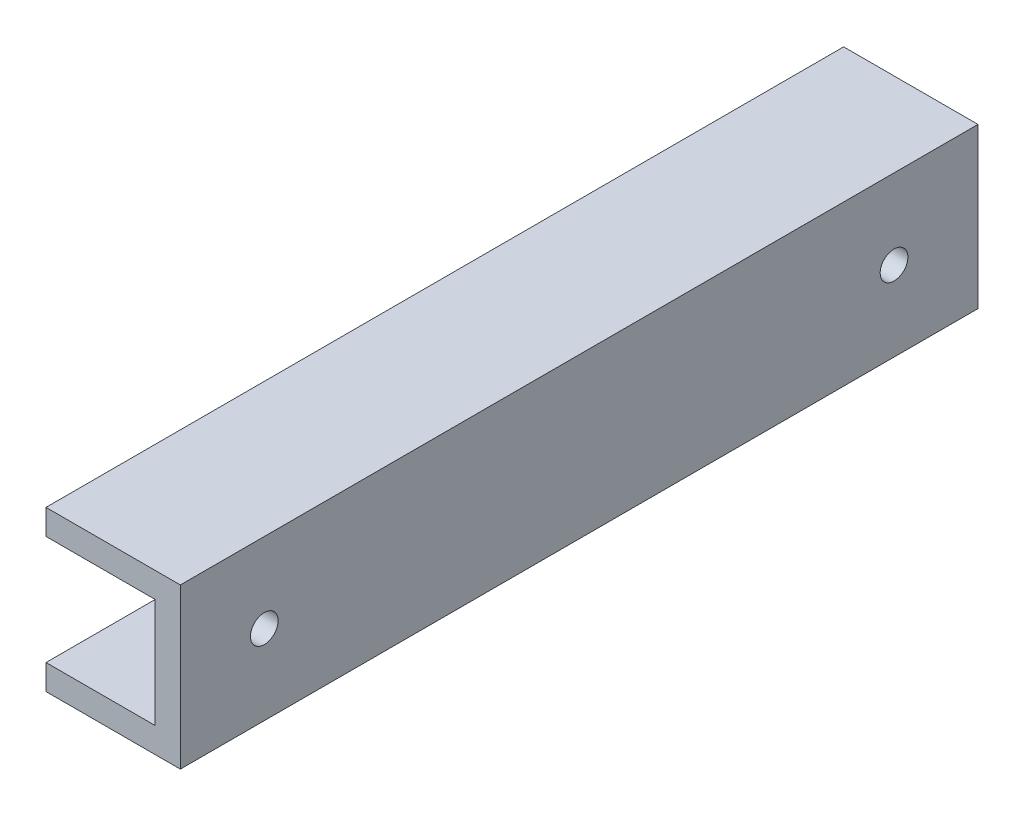
ISO-10303-21;
HEADER;
FILE_DESCRIPTION(('STEP AP214'),'2;1');
FILE_NAME('part.step','',(''),(''),'','','');
FILE_SCHEMA(('AUTOMOTIVE_DESIGN { 1 0 10303 214 1 1 1 1 }'));
ENDSEC;
DATA;
#1=APPLICATION_CONTEXT('core data for automotive mechanical design processes');
#2=APPLICATION_PROTOCOL_DEFINITION('international standard','automotive_design',2000,#1);
#3=PRODUCT_CONTEXT('',#1,'mechanical');
#4=PRODUCT('Part','Part','',(#3));
#5=PRODUCT_RELATED_PRODUCT_CATEGORY('part','',(#4));
#6=PRODUCT_DEFINITION_FORMATION('','',#4);
#7=PRODUCT_DEFINITION_CONTEXT('part definition',#1,'design');
#8=PRODUCT_DEFINITION('design','',#6,#7);
#9=PRODUCT_DEFINITION_SHAPE('','',#8);
#10=(LENGTH_UNIT() NAMED_UNIT(*) SI_UNIT(.MILLI.,.METRE.));
#11=(NAMED_UNIT(*) PLANE_ANGLE_UNIT() SI_UNIT($,.RADIAN.));
#12=(NAMED_UNIT(*) SI_UNIT($,.STERADIAN.) SOLID_ANGLE_UNIT());
#13=UNCERTAINTY_MEASURE_WITH_UNIT(LENGTH_MEASURE(1.E-05),#10,'distance_accuracy_value','');
#14=(GEOMETRIC_REPRESENTATION_CONTEXT(3) GLOBAL_UNCERTAINTY_ASSIGNED_CONTEXT((#13)) GLOBAL_UNIT_ASSIGNED_CONTEXT((#10,
#11,#12)) REPRESENTATION_CONTEXT('',''));
#15=CARTESIAN_POINT('',(0.,0.,0.));
#16=DIRECTION('',(0.,0.,1.));
#17=DIRECTION('',(1.,0.,0.));
#18=AXIS2_PLACEMENT_3D('',#15,#16,#17);
#19=CARTESIAN_POINT('',(3.,13.,23.));
#20=DIRECTION('',(0.,0.,1.));
#21=DIRECTION('',(0.,-1.,0.));
#22=AXIS2_PLACEMENT_3D('',#19,#20,#21);
#23=PLANE('',#22);
#24=DIRECTION('',(1.,0.,0.));
#25=VECTOR('',#24,1.);
#26=CARTESIAN_POINT('',(3.,13.,23.));
#27=LINE('',#26,#25);
#28=CARTESIAN_POINT('',(3.,13.,23.));
#29=VERTEX_POINT('',#28);
#30=CARTESIAN_POINT('',(8.99999999999997,13.,23.));
#31=VERTEX_POINT('',#30);
#32=EDGE_CURVE('E237',#29,#31,#27,.T.);
#33=ORIENTED_EDGE('',*,*,#32,.T.);
#34=DIRECTION('',(0.,-1.,0.));
#35=VECTOR('',#34,1.);
#36=CARTESIAN_POINT('',(8.99999999999997,13.,23.));
#37=LINE('',#36,#35);
#38=CARTESIAN_POINT('',(9.00000000000001,9.,23.));
#39=VERTEX_POINT('',#38);
#40=EDGE_CURVE('E71',#31,#39,#37,.T.);
#41=ORIENTED_EDGE('',*,*,#40,.T.);
#42=DIRECTION('',(-1.,0.,0.));
#43=VECTOR('',#42,1.);
#44=CARTESIAN_POINT('',(6.,9.,23.));
#45=LINE('',#44,#43);
#46=CARTESIAN_POINT('',(3.,9.,23.));
#47=VERTEX_POINT('',#46);
#48=EDGE_CURVE('E352',#39,#47,#45,.T.);
#49=ORIENTED_EDGE('',*,*,#48,.T.);
#50=DIRECTION('',(0.,-1.,0.));
#51=VECTOR('',#50,1.);
#52=CARTESIAN_POINT('',(3.,13.,23.));
#53=LINE('',#52,#51);
#54=EDGE_CURVE('E223',#29,#47,#53,.T.);
#55=ORIENTED_EDGE('',*,*,#54,.F.);
#56=EDGE_LOOP('',(#33,#41,#49,#55));
#57=FACE_BOUND('',#56,.T.);
#58=ADVANCED_FACE('F62',(#57),#23,.F.);
#59=CARTESIAN_POINT('',(3.,13.,72.));
#60=DIRECTION('',(0.,0.,-1.));
#61=DIRECTION('',(-1.,0.,0.));
#62=AXIS2_PLACEMENT_3D('',#59,#60,#61);
#63=PLANE('',#62);
#64=DIRECTION('',(1.,0.,0.));
#65=VECTOR('',#64,1.);
#66=CARTESIAN_POINT('',(3.,0.,72.));
#67=LINE('',#66,#65);
#68=CARTESIAN_POINT('',(3.,0.,72.));
#69=VERTEX_POINT('',#68);
#70=CARTESIAN_POINT('',(8.99999999999997,0.,72.));
#71=VERTEX_POINT('',#70);
#72=EDGE_CURVE('E224',#69,#71,#67,.T.);
#73=ORIENTED_EDGE('',*,*,#72,.T.);
#74=DIRECTION('',(0.,1.,0.));
#75=VECTOR('',#74,1.);
#76=CARTESIAN_POINT('',(8.99999999999997,13.,72.));
#77=LINE('',#76,#75);
#78=CARTESIAN_POINT('',(9.00000000000003,4.,72.));
#79=VERTEX_POINT('',#78);
#80=EDGE_CURVE('E334',#71,#79,#77,.T.);
#81=ORIENTED_EDGE('',*,*,#80,.T.);
#82=DIRECTION('',(-1.,0.,0.));
#83=VECTOR('',#82,1.);
#84=CARTESIAN_POINT('',(6.,4.,72.));
#85=LINE('',#84,#83);
#86=CARTESIAN_POINT('',(3.,4.,72.));
#87=VERTEX_POINT('',#86);
#88=EDGE_CURVE('E209',#79,#87,#85,.T.);
#89=ORIENTED_EDGE('',*,*,#88,.T.);
#90=DIRECTION('',(0.,1.,0.));
#91=VECTOR('',#90,1.);
#92=CARTESIAN_POINT('',(3.,13.,72.));
#93=LINE('',#92,#91);
#94=EDGE_CURVE('E218',#69,#87,#93,.T.);
#95=ORIENTED_EDGE('',*,*,#94,.F.);
#96=EDGE_LOOP('',(#73,#81,#89,#95));
#97=FACE_BOUND('',#96,.T.);
#98=ADVANCED_FACE('F424',(#97),#63,.F.);
#99=CARTESIAN_POINT('',(3.,0.,0.));
#100=DIRECTION('',(-1.,0.,0.));
#101=DIRECTION('',(0.,0.,1.));
#102=AXIS2_PLACEMENT_3D('',#99,#100,#101);
#103=PLANE('',#102);
#104=DIRECTION('',(0.,0.,-1.));
#105=VECTOR('',#104,1.);
#106=CARTESIAN_POINT('',(3.,9.,23.));
#107=LINE('',#106,#105);
#108=CARTESIAN_POINT('',(3.,9.,72.));
#109=VERTEX_POINT('',#108);
#110=EDGE_CURVE('E219',#109,#47,#107,.T.);
#111=ORIENTED_EDGE('',*,*,#110,.F.);
#112=CARTESIAN_POINT('',(3.,13.,72.));
#113=VERTEX_POINT('',#112);
#114=EDGE_CURVE('E361',#109,#113,#93,.T.);
#115=ORIENTED_EDGE('',*,*,#114,.T.);
#116=DIRECTION('',(0.,0.,-1.));
#117=VECTOR('',#116,1.);
#118=CARTESIAN_POINT('',(3.,13.,23.));
#119=LINE('',#118,#117);
#120=EDGE_CURVE('E234',#113,#29,#119,.T.);
#121=ORIENTED_EDGE('',*,*,#120,.T.);
#122=ORIENTED_EDGE('',*,*,#54,.T.);
#123=EDGE_LOOP('',(#111,#115,#121,#122));
#124=FACE_BOUND('',#123,.T.);
#125=ADVANCED_FACE('F429',(#124),#103,.T.);
#126=CARTESIAN_POINT('',(0.,0.,95.));
#127=DIRECTION('',(0.,1.,0.));
#128=DIRECTION('',(0.,0.,1.));
#129=AXIS2_PLACEMENT_3D('',#126,#127,#128);
#130=PLANE('',#129);
#131=DIRECTION('',(0.,0.,-1.));
#132=VECTOR('',#131,1.);
#133=CARTESIAN_POINT('',(13.,0.,95.));
#134=LINE('',#133,#132);
#135=CARTESIAN_POINT('',(13.,0.,95.));
#136=VERTEX_POINT('',#135);
#137=CARTESIAN_POINT('',(13.,0.,76.));
#138=VERTEX_POINT('',#137);
#139=EDGE_CURVE('E285',#136,#138,#134,.T.);
#140=ORIENTED_EDGE('',*,*,#139,.T.);
#141=DIRECTION('',(-0.707106781186551,0.,-0.707106781186544));
#142=VECTOR('',#141,1.);
#143=CARTESIAN_POINT('',(15.9999999999999,0.,78.9999999999999));
#144=LINE('',#143,#142);
#145=EDGE_CURVE('E344',#138,#71,#144,.T.);
#146=ORIENTED_EDGE('',*,*,#145,.T.);
#147=ORIENTED_EDGE('',*,*,#72,.F.);
#148=DIRECTION('',(0.,0.,1.));
#149=VECTOR('',#148,1.);
#150=CARTESIAN_POINT('',(3.,0.,23.));
#151=LINE('',#150,#149);
#152=CARTESIAN_POINT('',(3.,0.,23.));
#153=VERTEX_POINT('',#152);
#154=EDGE_CURVE('E227',#153,#69,#151,.T.);
#155=ORIENTED_EDGE('',*,*,#154,.F.);
#156=DIRECTION('',(1.,0.,0.));
#157=VECTOR('',#156,1.);
#158=CARTESIAN_POINT('',(3.,0.,23.));
#159=LINE('',#158,#157);
#160=CARTESIAN_POINT('',(8.99999999999997,0.,23.));
#161=VERTEX_POINT('',#160);
#162=EDGE_CURVE('E222',#153,#161,#159,.T.);
#163=ORIENTED_EDGE('',*,*,#162,.T.);
#164=DIRECTION('',(0.707106781186552,0.,-0.707106781186543));
#165=VECTOR('',#164,1.);
#166=CARTESIAN_POINT('',(-31.5000000000001,0.,63.4999999999996));
#167=LINE('',#166,#165);
#168=CARTESIAN_POINT('',(13.,0.,19.));
#169=VERTEX_POINT('',#168);
#170=EDGE_CURVE('E78',#161,#169,#167,.T.);
#171=ORIENTED_EDGE('',*,*,#170,.T.);
#172=CARTESIAN_POINT('',(13.,0.,0.));
#173=VERTEX_POINT('',#172);
#174=EDGE_CURVE('E284',#169,#173,#134,.T.);
#175=ORIENTED_EDGE('',*,*,#174,.T.);
#176=DIRECTION('',(1.,0.,0.));
#177=VECTOR('',#176,1.);
#178=CARTESIAN_POINT('',(0.,0.,0.));
#179=LINE('',#178,#177);
#180=CARTESIAN_POINT('',(0.,0.,0.));
#181=VERTEX_POINT('',#180);
#182=EDGE_CURVE('E260',#181,#173,#179,.T.);
#183=ORIENTED_EDGE('',*,*,#182,.F.);
#184=DIRECTION('',(0.,0.,-1.));
#185=VECTOR('',#184,1.);
#186=CARTESIAN_POINT('',(0.,0.,95.));
#187=LINE('',#186,#185);
#188=CARTESIAN_POINT('',(0.,0.,95.));
#189=VERTEX_POINT('',#188);
#190=EDGE_CURVE('E288',#189,#181,#187,.T.);
#191=ORIENTED_EDGE('',*,*,#190,.F.);
#192=DIRECTION('',(1.,0.,0.));
#193=VECTOR('',#192,1.);
#194=CARTESIAN_POINT('',(0.,0.,95.));
#195=LINE('',#194,#193);
#196=EDGE_CURVE('E261',#189,#136,#195,.T.);
#197=ORIENTED_EDGE('',*,*,#196,.T.);
#198=EDGE_LOOP('',(#140,#146,#147,#155,#163,#171,#175,#183,#191,#197));
#199=FACE_BOUND('',#198,.T.);
#200=ADVANCED_FACE('F397',(#199),#130,.T.);
#201=CARTESIAN_POINT('',(13.,0.,95.));
#202=DIRECTION('',(-1.,0.,0.));
#203=DIRECTION('',(0.,0.,1.));
#204=AXIS2_PLACEMENT_3D('',#201,#202,#203);
#205=PLANE('',#204);
#206=CARTESIAN_POINT('',(13.,6.5,85.));
#207=DIRECTION('',(-1.,0.,0.));
#208=DIRECTION('',(0.,0.,1.));
#209=AXIS2_PLACEMENT_3D('',#206,#207,#208);
#210=CIRCLE('',#209,1.65);
#211=CARTESIAN_POINT('',(13.,6.5,86.65));
#212=VERTEX_POINT('',#211);
#213=EDGE_CURVE('E248',#212,#212,#210,.T.);
#214=ORIENTED_EDGE('',*,*,#213,.F.);
#215=EDGE_LOOP('',(#214));
#216=FACE_BOUND('',#215,.T.);
#217=DIRECTION('',(0.,0.,-1.));
#218=VECTOR('',#217,1.);
#219=CARTESIAN_POINT('',(13.,13.,95.));
#220=LINE('',#219,#218);
#221=CARTESIAN_POINT('',(13.,13.,95.));
#222=VERTEX_POINT('',#221);
#223=CARTESIAN_POINT('',(13.,13.,76.));
#224=VERTEX_POINT('',#223);
#225=EDGE_CURVE('E281',#222,#224,#220,.T.);
#226=ORIENTED_EDGE('',*,*,#225,.T.);
#227=DIRECTION('',(0.,-1.,0.));
#228=VECTOR('',#227,1.);
#229=CARTESIAN_POINT('',(13.,0.,76.));
#230=LINE('',#229,#228);
#231=EDGE_CURVE('E341',#224,#138,#230,.T.);
#232=ORIENTED_EDGE('',*,*,#231,.T.);
#233=ORIENTED_EDGE('',*,*,#139,.F.);
#234=DIRECTION('',(0.,1.,0.));
#235=VECTOR('',#234,1.);
#236=CARTESIAN_POINT('',(13.,0.,95.));
#237=LINE('',#236,#235);
#238=EDGE_CURVE('E263',#136,#222,#237,.T.);
#239=ORIENTED_EDGE('',*,*,#238,.T.);
#240=EDGE_LOOP('',(#226,#232,#233,#239));
#241=FACE_BOUND('',#240,.T.);
#242=ADVANCED_FACE('F395',(#216,#241),#205,.T.);
#243=CARTESIAN_POINT('',(0.,13.,95.));
#244=DIRECTION('',(0.,-1.,0.));
#245=DIRECTION('',(0.,0.,-1.));
#246=AXIS2_PLACEMENT_3D('',#243,#244,#245);
#247=PLANE('',#246);
#248=DIRECTION('',(1.,0.,0.));
#249=VECTOR('',#248,1.);
#250=CARTESIAN_POINT('',(3.,13.,72.));
#251=LINE('',#250,#249);
#252=CARTESIAN_POINT('',(8.99999999999997,13.,72.));
#253=VERTEX_POINT('',#252);
#254=EDGE_CURVE('E229',#113,#253,#251,.T.);
#255=ORIENTED_EDGE('',*,*,#254,.T.);
#256=DIRECTION('',(0.707106781186551,0.,0.707106781186544));
#257=VECTOR('',#256,1.);
#258=CARTESIAN_POINT('',(15.9999999999999,13.,78.9999999999999));
#259=LINE('',#258,#257);
#260=EDGE_CURVE('E339',#253,#224,#259,.T.);
#261=ORIENTED_EDGE('',*,*,#260,.T.);
#262=ORIENTED_EDGE('',*,*,#225,.F.);
#263=DIRECTION('',(-1.,0.,0.));
#264=VECTOR('',#263,1.);
#265=CARTESIAN_POINT('',(0.,13.,95.));
#266=LINE('',#265,#264);
#267=CARTESIAN_POINT('',(0.,13.,95.));
#268=VERTEX_POINT('',#267);
#269=EDGE_CURVE('E267',#222,#268,#266,.T.);
#270=ORIENTED_EDGE('',*,*,#269,.T.);
#271=DIRECTION('',(0.,0.,-1.));
#272=VECTOR('',#271,1.);
#273=CARTESIAN_POINT('',(0.,13.,95.));
#274=LINE('',#273,#272);
#275=CARTESIAN_POINT('',(0.,13.,0.));
#276=VERTEX_POINT('',#275);
#277=EDGE_CURVE('E270',#268,#276,#274,.T.);
#278=ORIENTED_EDGE('',*,*,#277,.T.);
#279=DIRECTION('',(-1.,0.,0.));
#280=VECTOR('',#279,1.);
#281=CARTESIAN_POINT('',(0.,13.,0.));
#282=LINE('',#281,#280);
#283=CARTESIAN_POINT('',(13.,13.,0.));
#284=VERTEX_POINT('',#283);
#285=EDGE_CURVE('E264',#284,#276,#282,.T.);
#286=ORIENTED_EDGE('',*,*,#285,.F.);
#287=CARTESIAN_POINT('',(13.,13.,19.));
#288=VERTEX_POINT('',#287);
#289=EDGE_CURVE('E280',#288,#284,#220,.T.);
#290=ORIENTED_EDGE('',*,*,#289,.F.);
#291=DIRECTION('',(-0.707106781186552,0.,0.707106781186543));
#292=VECTOR('',#291,1.);
#293=CARTESIAN_POINT('',(-31.5000000000001,13.,63.4999999999996));
#294=LINE('',#293,#292);
#295=EDGE_CURVE('E337',#288,#31,#294,.T.);
#296=ORIENTED_EDGE('',*,*,#295,.T.);
#297=ORIENTED_EDGE('',*,*,#32,.F.);
#298=ORIENTED_EDGE('',*,*,#120,.F.);
#299=EDGE_LOOP('',(#255,#261,#262,#270,#278,#286,#290,#296,#297,#298));
#300=FACE_BOUND('',#299,.T.);
#301=ADVANCED_FACE('F384',(#300),#247,.T.);
#302=CARTESIAN_POINT('',(13.,6.5,10.));
#303=DIRECTION('',(-1.,0.,0.));
#304=DIRECTION('',(0.,0.,1.));
#305=AXIS2_PLACEMENT_3D('',#302,#303,#304);
#306=CIRCLE('',#305,1.65);
#307=CARTESIAN_POINT('',(13.,6.5,11.65));
#308=VERTEX_POINT('',#307);
#309=EDGE_CURVE('E256',#308,#308,#306,.T.);
#310=ORIENTED_EDGE('',*,*,#309,.F.);
#311=EDGE_LOOP('',(#310));
#312=FACE_BOUND('',#311,.T.);
#313=ORIENTED_EDGE('',*,*,#174,.F.);
#314=DIRECTION('',(0.,1.,0.));
#315=VECTOR('',#314,1.);
#316=CARTESIAN_POINT('',(13.,0.,19.));
#317=LINE('',#316,#315);
#318=EDGE_CURVE('E12',#169,#288,#317,.T.);
#319=ORIENTED_EDGE('',*,*,#318,.T.);
#320=ORIENTED_EDGE('',*,*,#289,.T.);
#321=DIRECTION('',(0.,1.,0.));
#322=VECTOR('',#321,1.);
#323=CARTESIAN_POINT('',(13.,0.,0.));
#324=LINE('',#323,#322);
#325=EDGE_CURVE('E273',#173,#284,#324,.T.);
#326=ORIENTED_EDGE('',*,*,#325,.F.);
#327=EDGE_LOOP('',(#313,#319,#320,#326));
#328=FACE_BOUND('',#327,.T.);
#329=ADVANCED_FACE('F417',(#312,#328),#205,.T.);
#330=CARTESIAN_POINT('',(0.,0.,95.));
#331=DIRECTION('',(0.,0.,1.));
#332=DIRECTION('',(1.,0.,0.));
#333=AXIS2_PLACEMENT_3D('',#330,#331,#332);
#334=PLANE('',#333);
#335=DIRECTION('',(-1.,0.,0.));
#336=VECTOR('',#335,1.);
#337=CARTESIAN_POINT('',(0.,16.,95.));
#338=LINE('',#337,#336);
#339=CARTESIAN_POINT('',(16.,16.,95.));
#340=VERTEX_POINT('',#339);
#341=CARTESIAN_POINT('',(0.,16.,95.));
#342=VERTEX_POINT('',#341);
#343=EDGE_CURVE('E296',#340,#342,#338,.T.);
#344=ORIENTED_EDGE('',*,*,#343,.T.);
#345=DIRECTION('',(0.,-1.,0.));
#346=VECTOR('',#345,1.);
#347=CARTESIAN_POINT('',(0.,0.,95.));
#348=LINE('',#347,#346);
#349=EDGE_CURVE('E244',#342,#268,#348,.T.);
#350=ORIENTED_EDGE('',*,*,#349,.T.);
#351=ORIENTED_EDGE('',*,*,#269,.F.);
#352=ORIENTED_EDGE('',*,*,#238,.F.);
#353=ORIENTED_EDGE('',*,*,#196,.F.);
#354=CARTESIAN_POINT('',(0.,-3.,95.));
#355=VERTEX_POINT('',#354);
#356=EDGE_CURVE('E249',#189,#355,#348,.T.);
#357=ORIENTED_EDGE('',*,*,#356,.T.);
#358=DIRECTION('',(1.,0.,0.));
#359=VECTOR('',#358,1.);
#360=CARTESIAN_POINT('',(0.,-3.,95.));
#361=LINE('',#360,#359);
#362=CARTESIAN_POINT('',(16.,-3.,95.));
#363=VERTEX_POINT('',#362);
#364=EDGE_CURVE('E291',#355,#363,#361,.T.);
#365=ORIENTED_EDGE('',*,*,#364,.T.);
#366=DIRECTION('',(0.,1.,0.));
#367=VECTOR('',#366,1.);
#368=CARTESIAN_POINT('',(16.,0.,95.));
#369=LINE('',#368,#367);
#370=EDGE_CURVE('E293',#363,#340,#369,.T.);
#371=ORIENTED_EDGE('',*,*,#370,.T.);
#372=EDGE_LOOP('',(#344,#350,#351,#352,#353,#357,#365,#371));
#373=FACE_BOUND('',#372,.T.);
#374=ADVANCED_FACE('F404',(#373),#334,.T.);
#375=CARTESIAN_POINT('',(0.,0.,0.));
#376=DIRECTION('',(0.,0.,1.));
#377=DIRECTION('',(1.,0.,0.));
#378=AXIS2_PLACEMENT_3D('',#375,#376,#377);
#379=PLANE('',#378);
#380=DIRECTION('',(0.,-1.,0.));
#381=VECTOR('',#380,1.);
#382=CARTESIAN_POINT('',(0.,0.,0.));
#383=LINE('',#382,#381);
#384=CARTESIAN_POINT('',(0.,16.,0.));
#385=VERTEX_POINT('',#384);
#386=EDGE_CURVE('E242',#385,#276,#383,.T.);
#387=ORIENTED_EDGE('',*,*,#386,.F.);
#388=DIRECTION('',(-1.,0.,0.));
#389=VECTOR('',#388,1.);
#390=CARTESIAN_POINT('',(0.,16.,0.));
#391=LINE('',#390,#389);
#392=CARTESIAN_POINT('',(16.,16.,0.));
#393=VERTEX_POINT('',#392);
#394=EDGE_CURVE('E294',#393,#385,#391,.T.);
#395=ORIENTED_EDGE('',*,*,#394,.F.);
#396=DIRECTION('',(0.,1.,0.));
#397=VECTOR('',#396,1.);
#398=CARTESIAN_POINT('',(16.,0.,0.));
#399=LINE('',#398,#397);
#400=CARTESIAN_POINT('',(16.,-3.,0.));
#401=VERTEX_POINT('',#400);
#402=EDGE_CURVE('E301',#401,#393,#399,.T.);
#403=ORIENTED_EDGE('',*,*,#402,.F.);
#404=DIRECTION('',(1.,0.,0.));
#405=VECTOR('',#404,1.);
#406=CARTESIAN_POINT('',(0.,-3.,0.));
#407=LINE('',#406,#405);
#408=CARTESIAN_POINT('',(0.,-3.,0.));
#409=VERTEX_POINT('',#408);
#410=EDGE_CURVE('E290',#409,#401,#407,.T.);
#411=ORIENTED_EDGE('',*,*,#410,.F.);
#412=EDGE_CURVE('E241',#181,#409,#383,.T.);
#413=ORIENTED_EDGE('',*,*,#412,.F.);
#414=ORIENTED_EDGE('',*,*,#182,.T.);
#415=ORIENTED_EDGE('',*,*,#325,.T.);
#416=ORIENTED_EDGE('',*,*,#285,.T.);
#417=EDGE_LOOP('',(#387,#395,#403,#411,#413,#414,#415,#416));
#418=FACE_BOUND('',#417,.T.);
#419=ADVANCED_FACE('F412',(#418),#379,.F.);
#420=CARTESIAN_POINT('',(0.,-3.,95.));
#421=DIRECTION('',(0.,1.,0.));
#422=DIRECTION('',(0.,0.,1.));
#423=AXIS2_PLACEMENT_3D('',#420,#421,#422);
#424=PLANE('',#423);
#425=DIRECTION('',(0.,0.,1.));
#426=VECTOR('',#425,1.);
#427=CARTESIAN_POINT('',(0.,-3.,95.));
#428=LINE('',#427,#426);
#429=EDGE_CURVE('E250',#409,#355,#428,.T.);
#430=ORIENTED_EDGE('',*,*,#429,.F.);
#431=ORIENTED_EDGE('',*,*,#410,.T.);
#432=DIRECTION('',(0.,0.,-1.));
#433=VECTOR('',#432,1.);
#434=CARTESIAN_POINT('',(16.,-3.,95.));
#435=LINE('',#434,#433);
#436=EDGE_CURVE('E307',#363,#401,#435,.T.);
#437=ORIENTED_EDGE('',*,*,#436,.F.);
#438=ORIENTED_EDGE('',*,*,#364,.F.);
#439=EDGE_LOOP('',(#430,#431,#437,#438));
#440=FACE_BOUND('',#439,.T.);
#441=ADVANCED_FACE('F467',(#440),#424,.F.);
#442=CARTESIAN_POINT('',(0.,16.,95.));
#443=DIRECTION('',(0.,-1.,0.));
#444=DIRECTION('',(0.,0.,-1.));
#445=AXIS2_PLACEMENT_3D('',#442,#443,#444);
#446=PLANE('',#445);
#447=DIRECTION('',(0.,0.,-1.));
#448=VECTOR('',#447,1.);
#449=CARTESIAN_POINT('',(0.,16.,95.));
#450=LINE('',#449,#448);
#451=EDGE_CURVE('E245',#342,#385,#450,.T.);
#452=ORIENTED_EDGE('',*,*,#451,.F.);
#453=ORIENTED_EDGE('',*,*,#343,.F.);
#454=DIRECTION('',(0.,0.,-1.));
#455=VECTOR('',#454,1.);
#456=CARTESIAN_POINT('',(16.,16.,95.));
#457=LINE('',#456,#455);
#458=EDGE_CURVE('E299',#340,#393,#457,.T.);
#459=ORIENTED_EDGE('',*,*,#458,.T.);
#460=ORIENTED_EDGE('',*,*,#394,.T.);
#461=EDGE_LOOP('',(#452,#453,#459,#460));
#462=FACE_BOUND('',#461,.T.);
#463=ADVANCED_FACE('F468',(#462),#446,.F.);
#464=CARTESIAN_POINT('',(16.,0.,95.));
#465=DIRECTION('',(-1.,0.,0.));
#466=DIRECTION('',(0.,0.,1.));
#467=AXIS2_PLACEMENT_3D('',#464,#465,#466);
#468=PLANE('',#467);
#469=CARTESIAN_POINT('',(16.,6.5,10.));
#470=DIRECTION('',(-1.,0.,0.));
#471=DIRECTION('',(0.,0.,1.));
#472=AXIS2_PLACEMENT_3D('',#469,#470,#471);
#473=CIRCLE('',#472,1.65);
#474=CARTESIAN_POINT('',(16.,6.5,11.65));
#475=VERTEX_POINT('',#474);
#476=EDGE_CURVE('E257',#475,#475,#473,.T.);
#477=ORIENTED_EDGE('',*,*,#476,.T.);
#478=EDGE_LOOP('',(#477));
#479=FACE_BOUND('',#478,.T.);
#480=CARTESIAN_POINT('',(16.,6.5,85.));
#481=DIRECTION('',(-1.,0.,0.));
#482=DIRECTION('',(0.,0.,1.));
#483=AXIS2_PLACEMENT_3D('',#480,#481,#482);
#484=CIRCLE('',#483,1.65);
#485=CARTESIAN_POINT('',(16.,6.5,86.65));
#486=VERTEX_POINT('',#485);
#487=EDGE_CURVE('E253',#486,#486,#484,.T.);
#488=ORIENTED_EDGE('',*,*,#487,.T.);
#489=EDGE_LOOP('',(#488));
#490=FACE_BOUND('',#489,.T.);
#491=ORIENTED_EDGE('',*,*,#402,.T.);
#492=ORIENTED_EDGE('',*,*,#458,.F.);
#493=ORIENTED_EDGE('',*,*,#370,.F.);
#494=ORIENTED_EDGE('',*,*,#436,.T.);
#495=EDGE_LOOP('',(#491,#492,#493,#494));
#496=FACE_BOUND('',#495,.T.);
#497=ADVANCED_FACE('F454',(#479,#490,#496),#468,.F.);
#498=CARTESIAN_POINT('',(27.,6.5,85.));
#499=DIRECTION('',(-1.,0.,0.));
#500=DIRECTION('',(0.,0.,1.));
#501=AXIS2_PLACEMENT_3D('',#498,#499,#500);
#502=CYLINDRICAL_SURFACE('',#501,1.65);
#503=CARTESIAN_POINT('',(13.,6.5,86.65));
#504=CARTESIAN_POINT('',(13.03125,6.5,86.65));
#505=CARTESIAN_POINT('',(13.0625,6.5,86.65));
#506=CARTESIAN_POINT('',(13.125,6.5,86.65));
#507=CARTESIAN_POINT('',(13.15625,6.5,86.65));
#508=CARTESIAN_POINT('',(13.21875,6.5,86.65));
#509=CARTESIAN_POINT('',(13.25,6.5,86.65));
#510=CARTESIAN_POINT('',(13.3125,6.5,86.65));
#511=CARTESIAN_POINT('',(13.34375,6.5,86.65));
#512=CARTESIAN_POINT('',(13.40625,6.5,86.65));
#513=CARTESIAN_POINT('',(13.4375,6.5,86.65));
#514=CARTESIAN_POINT('',(13.5,6.5,86.65));
#515=CARTESIAN_POINT('',(13.53125,6.5,86.65));
#516=CARTESIAN_POINT('',(13.59375,6.5,86.65));
#517=CARTESIAN_POINT('',(13.625,6.5,86.65));
#518=CARTESIAN_POINT('',(13.6875,6.5,86.65));
#519=CARTESIAN_POINT('',(13.71875,6.5,86.65));
#520=CARTESIAN_POINT('',(13.78125,6.5,86.65));
#521=CARTESIAN_POINT('',(13.8125,6.5,86.65));
#522=CARTESIAN_POINT('',(13.875,6.5,86.65));
#523=CARTESIAN_POINT('',(13.90625,6.5,86.65));
#524=CARTESIAN_POINT('',(13.96875,6.5,86.65));
#525=CARTESIAN_POINT('',(14.,6.5,86.65));
#526=CARTESIAN_POINT('',(14.0625,6.5,86.65));
#527=CARTESIAN_POINT('',(14.09375,6.5,86.65));
#528=CARTESIAN_POINT('',(14.15625,6.5,86.65));
#529=CARTESIAN_POINT('',(14.1875,6.5,86.65));
#530=CARTESIAN_POINT('',(14.25,6.5,86.65));
#531=CARTESIAN_POINT('',(14.28125,6.5,86.65));
#532=CARTESIAN_POINT('',(14.34375,6.5,86.65));
#533=CARTESIAN_POINT('',(14.375,6.5,86.65));
#534=CARTESIAN_POINT('',(14.4375,6.5,86.65));
#535=CARTESIAN_POINT('',(14.46875,6.5,86.65));
#536=CARTESIAN_POINT('',(14.53125,6.5,86.65));
#537=CARTESIAN_POINT('',(14.5625,6.5,86.65));
#538=CARTESIAN_POINT('',(14.625,6.5,86.65));
#539=CARTESIAN_POINT('',(14.65625,6.5,86.65));
#540=CARTESIAN_POINT('',(14.71875,6.5,86.65));
#541=CARTESIAN_POINT('',(14.75,6.5,86.65));
#542=CARTESIAN_POINT('',(14.8125,6.5,86.65));
#543=CARTESIAN_POINT('',(14.84375,6.5,86.65));
#544=CARTESIAN_POINT('',(14.90625,6.5,86.65));
#545=CARTESIAN_POINT('',(14.9375,6.5,86.65));
#546=CARTESIAN_POINT('',(15.,6.5,86.65));
#547=CARTESIAN_POINT('',(15.03125,6.5,86.65));
#548=CARTESIAN_POINT('',(15.09375,6.5,86.65));
#549=CARTESIAN_POINT('',(15.125,6.5,86.65));
#550=CARTESIAN_POINT('',(15.1875,6.5,86.65));
#551=CARTESIAN_POINT('',(15.21875,6.5,86.65));
#552=CARTESIAN_POINT('',(15.28125,6.5,86.65));
#553=CARTESIAN_POINT('',(15.3125,6.5,86.65));
#554=CARTESIAN_POINT('',(15.375,6.5,86.65));
#555=CARTESIAN_POINT('',(15.40625,6.5,86.65));
#556=CARTESIAN_POINT('',(15.46875,6.5,86.65));
#557=CARTESIAN_POINT('',(15.5,6.5,86.65));
#558=CARTESIAN_POINT('',(15.5625,6.5,86.65));
#559=CARTESIAN_POINT('',(15.59375,6.5,86.65));
#560=CARTESIAN_POINT('',(15.65625,6.5,86.65));
#561=CARTESIAN_POINT('',(15.6875,6.5,86.65));
#562=CARTESIAN_POINT('',(15.75,6.5,86.65));
#563=CARTESIAN_POINT('',(15.78125,6.5,86.65));
#564=CARTESIAN_POINT('',(15.84375,6.5,86.65));
#565=CARTESIAN_POINT('',(15.875,6.5,86.65));
#566=CARTESIAN_POINT('',(15.9375,6.5,86.65));
#567=CARTESIAN_POINT('',(15.96875,6.5,86.65));
#568=CARTESIAN_POINT('',(16.,6.5,86.65));
#569=B_SPLINE_CURVE_WITH_KNOTS('',3,(#503,#504,#505,#506,#507,#508,#509,#510,#511,#512,#513,
#514,#515,#516,#517,#518,#519,#520,#521,#522,#523,#524,#525,#526,#527,#528,#529,#530,#531,#532,
#533,#534,#535,#536,#537,#538,#539,#540,#541,#542,#543,#544,#545,#546,#547,#548,#549,#550,#551,
#552,#553,#554,#555,#556,#557,#558,#559,#560,#561,#562,#563,#564,#565,#566,#567,#568),
.UNSPECIFIED.,.F.,.F.,(4,2,2,2,2,2,2,2,2,2,2,2,2,2,2,2,2,2,2,2,2,2,2,2,2,2,2,2,2,2,2,2,4),(0.,
0.0937500000000001,0.1875,0.28125,0.375,0.46875,0.5625,0.656250000000001,0.750000000000001,
0.843749999999999,0.937499999999999,1.03125,1.125,1.21875,1.3125,1.40625,1.5,1.59375,1.6875,
1.78125,1.875,1.96875,2.0625,2.15625,2.25,2.34375,2.4375,2.53125,2.625,2.71875,2.8125,2.90625,
3.),.UNSPECIFIED.);
#570=EDGE_CURVE('BSEAM450',#212,#486,#569,.T.);
#571=ORIENTED_EDGE('',*,*,#213,.T.);
#572=ORIENTED_EDGE('',*,*,#487,.F.);
#573=ORIENTED_EDGE('',*,*,#570,.T.);
#574=ORIENTED_EDGE('',*,*,#570,.F.);
#575=EDGE_LOOP('',(#571,#573,#572,#574));
#576=FACE_BOUND('',#575,.T.);
#577=ADVANCED_FACE('F450',(#576),#502,.F.);
#578=CARTESIAN_POINT('',(27.,6.5,10.));
#579=DIRECTION('',(-1.,0.,0.));
#580=DIRECTION('',(0.,0.,1.));
#581=AXIS2_PLACEMENT_3D('',#578,#579,#580);
#582=CYLINDRICAL_SURFACE('',#581,1.65);
#583=CARTESIAN_POINT('',(13.,6.5,11.65));
#584=CARTESIAN_POINT('',(13.03125,6.5,11.65));
#585=CARTESIAN_POINT('',(13.0625,6.5,11.65));
#586=CARTESIAN_POINT('',(13.125,6.5,11.65));
#587=CARTESIAN_POINT('',(13.15625,6.5,11.65));
#588=CARTESIAN_POINT('',(13.21875,6.5,11.65));
#589=CARTESIAN_POINT('',(13.25,6.5,11.65));
#590=CARTESIAN_POINT('',(13.3125,6.5,11.65));
#591=CARTESIAN_POINT('',(13.34375,6.5,11.65));
#592=CARTESIAN_POINT('',(13.40625,6.5,11.65));
#593=CARTESIAN_POINT('',(13.4375,6.5,11.65));
#594=CARTESIAN_POINT('',(13.5,6.5,11.65));
#595=CARTESIAN_POINT('',(13.53125,6.5,11.65));
#596=CARTESIAN_POINT('',(13.59375,6.5,11.65));
#597=CARTESIAN_POINT('',(13.625,6.5,11.65));
#598=CARTESIAN_POINT('',(13.6875,6.5,11.65));
#599=CARTESIAN_POINT('',(13.71875,6.5,11.65));
#600=CARTESIAN_POINT('',(13.78125,6.5,11.65));
#601=CARTESIAN_POINT('',(13.8125,6.5,11.65));
#602=CARTESIAN_POINT('',(13.875,6.5,11.65));
#603=CARTESIAN_POINT('',(13.90625,6.5,11.65));
#604=CARTESIAN_POINT('',(13.96875,6.5,11.65));
#605=CARTESIAN_POINT('',(14.,6.5,11.65));
#606=CARTESIAN_POINT('',(14.0625,6.5,11.65));
#607=CARTESIAN_POINT('',(14.09375,6.5,11.65));
#608=CARTESIAN_POINT('',(14.15625,6.5,11.65));
#609=CARTESIAN_POINT('',(14.1875,6.5,11.65));
#610=CARTESIAN_POINT('',(14.25,6.5,11.65));
#611=CARTESIAN_POINT('',(14.28125,6.5,11.65));
#612=CARTESIAN_POINT('',(14.34375,6.5,11.65));
#613=CARTESIAN_POINT('',(14.375,6.5,11.65));
#614=CARTESIAN_POINT('',(14.4375,6.5,11.65));
#615=CARTESIAN_POINT('',(14.46875,6.5,11.65));
#616=CARTESIAN_POINT('',(14.53125,6.5,11.65));
#617=CARTESIAN_POINT('',(14.5625,6.5,11.65));
#618=CARTESIAN_POINT('',(14.625,6.5,11.65));
#619=CARTESIAN_POINT('',(14.65625,6.5,11.65));
#620=CARTESIAN_POINT('',(14.71875,6.5,11.65));
#621=CARTESIAN_POINT('',(14.75,6.5,11.65));
#622=CARTESIAN_POINT('',(14.8125,6.5,11.65));
#623=CARTESIAN_POINT('',(14.84375,6.5,11.65));
#624=CARTESIAN_POINT('',(14.90625,6.5,11.65));
#625=CARTESIAN_POINT('',(14.9375,6.5,11.65));
#626=CARTESIAN_POINT('',(15.,6.5,11.65));
#627=CARTESIAN_POINT('',(15.03125,6.5,11.65));
#628=CARTESIAN_POINT('',(15.09375,6.5,11.65));
#629=CARTESIAN_POINT('',(15.125,6.5,11.65));
#630=CARTESIAN_POINT('',(15.1875,6.5,11.65));
#631=CARTESIAN_POINT('',(15.21875,6.5,11.65));
#632=CARTESIAN_POINT('',(15.28125,6.5,11.65));
#633=CARTESIAN_POINT('',(15.3125,6.5,11.65));
#634=CARTESIAN_POINT('',(15.375,6.5,11.65));
#635=CARTESIAN_POINT('',(15.40625,6.5,11.65));
#636=CARTESIAN_POINT('',(15.46875,6.5,11.65));
#637=CARTESIAN_POINT('',(15.5,6.5,11.65));
#638=CARTESIAN_POINT('',(15.5625,6.5,11.65));
#639=CARTESIAN_POINT('',(15.59375,6.5,11.65));
#640=CARTESIAN_POINT('',(15.65625,6.5,11.65));
#641=CARTESIAN_POINT('',(15.6875,6.5,11.65));
#642=CARTESIAN_POINT('',(15.75,6.5,11.65));
#643=CARTESIAN_POINT('',(15.78125,6.5,11.65));
#644=CARTESIAN_POINT('',(15.84375,6.5,11.65));
#645=CARTESIAN_POINT('',(15.875,6.5,11.65));
#646=CARTESIAN_POINT('',(15.9375,6.5,11.65));
#647=CARTESIAN_POINT('',(15.96875,6.5,11.65));
#648=CARTESIAN_POINT('',(16.,6.5,11.65));
#649=B_SPLINE_CURVE_WITH_KNOTS('',3,(#583,#584,#585,#586,#587,#588,#589,#590,#591,#592,#593,
#594,#595,#596,#597,#598,#599,#600,#601,#602,#603,#604,#605,#606,#607,#608,#609,#610,#611,#612,
#613,#614,#615,#616,#617,#618,#619,#620,#621,#622,#623,#624,#625,#626,#627,#628,#629,#630,#631,
#632,#633,#634,#635,#636,#637,#638,#639,#640,#641,#642,#643,#644,#645,#646,#647,#648),
.UNSPECIFIED.,.F.,.F.,(4,2,2,2,2,2,2,2,2,2,2,2,2,2,2,2,2,2,2,2,2,2,2,2,2,2,2,2,2,2,2,2,4),(0.,
0.0937500000000001,0.1875,0.28125,0.375,0.46875,0.5625,0.656250000000001,0.750000000000001,
0.843749999999999,0.937499999999999,1.03125,1.125,1.21875,1.3125,1.40625,1.5,1.59375,1.6875,
1.78125,1.875,1.96875,2.0625,2.15625,2.25,2.34375,2.4375,2.53125,2.625,2.71875,2.8125,2.90625,
3.),.UNSPECIFIED.);
#650=EDGE_CURVE('BSEAM446',#308,#475,#649,.T.);
#651=ORIENTED_EDGE('',*,*,#309,.T.);
#652=ORIENTED_EDGE('',*,*,#476,.F.);
#653=ORIENTED_EDGE('',*,*,#650,.T.);
#654=ORIENTED_EDGE('',*,*,#650,.F.);
#655=EDGE_LOOP('',(#651,#653,#652,#654));
#656=FACE_BOUND('',#655,.T.);
#657=ADVANCED_FACE('F446',(#656),#582,.F.);
#658=CARTESIAN_POINT('',(0.,0.,0.));
#659=DIRECTION('',(-1.,0.,0.));
#660=DIRECTION('',(0.,0.,1.));
#661=AXIS2_PLACEMENT_3D('',#658,#659,#660);
#662=PLANE('',#661);
#663=ORIENTED_EDGE('',*,*,#451,.T.);
#664=ORIENTED_EDGE('',*,*,#386,.T.);
#665=ORIENTED_EDGE('',*,*,#277,.F.);
#666=ORIENTED_EDGE('',*,*,#349,.F.);
#667=EDGE_LOOP('',(#663,#664,#665,#666));
#668=FACE_BOUND('',#667,.T.);
#669=ADVANCED_FACE('F441',(#668),#662,.T.);
#670=ORIENTED_EDGE('',*,*,#429,.T.);
#671=ORIENTED_EDGE('',*,*,#356,.F.);
#672=ORIENTED_EDGE('',*,*,#190,.T.);
#673=ORIENTED_EDGE('',*,*,#412,.T.);
#674=EDGE_LOOP('',(#670,#671,#672,#673));
#675=FACE_BOUND('',#674,.T.);
#676=ADVANCED_FACE('F436',(#675),#662,.T.);
#677=DIRECTION('',(-1.,0.,0.));
#678=VECTOR('',#677,1.);
#679=CARTESIAN_POINT('',(6.,4.,23.));
#680=LINE('',#679,#678);
#681=CARTESIAN_POINT('',(9.00000000000001,4.,23.));
#682=VERTEX_POINT('',#681);
#683=CARTESIAN_POINT('',(3.,4.,23.));
#684=VERTEX_POINT('',#683);
#685=EDGE_CURVE('E199',#682,#684,#680,.T.);
#686=ORIENTED_EDGE('',*,*,#685,.F.);
#687=DIRECTION('',(0.,-1.,0.));
#688=VECTOR('',#687,1.);
#689=CARTESIAN_POINT('',(8.99999999999997,13.,23.));
#690=LINE('',#689,#688);
#691=EDGE_CURVE('E86',#682,#161,#690,.T.);
#692=ORIENTED_EDGE('',*,*,#691,.T.);
#693=ORIENTED_EDGE('',*,*,#162,.F.);
#694=EDGE_CURVE('E215',#684,#153,#53,.T.);
#695=ORIENTED_EDGE('',*,*,#694,.F.);
#696=EDGE_LOOP('',(#686,#692,#693,#695));
#697=FACE_BOUND('',#696,.T.);
#698=ADVANCED_FACE('F221',(#697),#23,.F.);
#699=DIRECTION('',(0.,0.,1.));
#700=VECTOR('',#699,1.);
#701=CARTESIAN_POINT('',(3.,4.,23.));
#702=LINE('',#701,#700);
#703=EDGE_CURVE('E203',#684,#87,#702,.T.);
#704=ORIENTED_EDGE('',*,*,#703,.F.);
#705=ORIENTED_EDGE('',*,*,#694,.T.);
#706=ORIENTED_EDGE('',*,*,#154,.T.);
#707=ORIENTED_EDGE('',*,*,#94,.T.);
#708=EDGE_LOOP('',(#704,#705,#706,#707));
#709=FACE_BOUND('',#708,.T.);
#710=ADVANCED_FACE('F214',(#709),#103,.T.);
#711=DIRECTION('',(-1.,0.,0.));
#712=VECTOR('',#711,1.);
#713=CARTESIAN_POINT('',(6.,9.,72.));
#714=LINE('',#713,#712);
#715=CARTESIAN_POINT('',(9.00000000000003,9.,72.));
#716=VERTEX_POINT('',#715);
#717=EDGE_CURVE('E362',#716,#109,#714,.T.);
#718=ORIENTED_EDGE('',*,*,#717,.F.);
#719=DIRECTION('',(0.,1.,0.));
#720=VECTOR('',#719,1.);
#721=CARTESIAN_POINT('',(8.99999999999997,13.,72.));
#722=LINE('',#721,#720);
#723=EDGE_CURVE('E332',#716,#253,#722,.T.);
#724=ORIENTED_EDGE('',*,*,#723,.T.);
#725=ORIENTED_EDGE('',*,*,#254,.F.);
#726=ORIENTED_EDGE('',*,*,#114,.F.);
#727=EDGE_LOOP('',(#718,#724,#725,#726));
#728=FACE_BOUND('',#727,.T.);
#729=ADVANCED_FACE('F432',(#728),#63,.F.);
#730=CARTESIAN_POINT('',(6.,9.,23.));
#731=DIRECTION('',(0.,1.,0.));
#732=DIRECTION('',(0.,0.,1.));
#733=AXIS2_PLACEMENT_3D('',#730,#731,#732);
#734=PLANE('',#733);
#735=ORIENTED_EDGE('',*,*,#110,.T.);
#736=ORIENTED_EDGE('',*,*,#48,.F.);
#737=DIRECTION('',(-0.707106781186549,0.,0.707106781186546));
#738=VECTOR('',#737,1.);
#739=CARTESIAN_POINT('',(7.5,9.,24.5));
#740=LINE('',#739,#738);
#741=CARTESIAN_POINT('',(6.,9.,26.));
#742=VERTEX_POINT('',#741);
#743=EDGE_CURVE('E330',#39,#742,#740,.T.);
#744=ORIENTED_EDGE('',*,*,#743,.T.);
#745=DIRECTION('',(0.,0.,-1.));
#746=VECTOR('',#745,1.);
#747=CARTESIAN_POINT('',(6.,9.,23.));
#748=LINE('',#747,#746);
#749=CARTESIAN_POINT('',(6.,9.,69.));
#750=VERTEX_POINT('',#749);
#751=EDGE_CURVE('E210',#750,#742,#748,.T.);
#752=ORIENTED_EDGE('',*,*,#751,.F.);
#753=DIRECTION('',(0.707106781186549,0.,0.707106781186546));
#754=VECTOR('',#753,1.);
#755=CARTESIAN_POINT('',(-17.,9.,46.0000000000001));
#756=LINE('',#755,#754);
#757=EDGE_CURVE('E324',#750,#716,#756,.T.);
#758=ORIENTED_EDGE('',*,*,#757,.T.);
#759=ORIENTED_EDGE('',*,*,#717,.T.);
#760=EDGE_LOOP('',(#735,#736,#744,#752,#758,#759));
#761=FACE_BOUND('',#760,.T.);
#762=ADVANCED_FACE('F357',(#761),#734,.F.);
#763=CARTESIAN_POINT('',(6.,4.,23.));
#764=DIRECTION('',(0.,-1.,0.));
#765=DIRECTION('',(0.,0.,-1.));
#766=AXIS2_PLACEMENT_3D('',#763,#764,#765);
#767=PLANE('',#766);
#768=ORIENTED_EDGE('',*,*,#703,.T.);
#769=ORIENTED_EDGE('',*,*,#88,.F.);
#770=DIRECTION('',(-0.707106781186549,0.,-0.707106781186546));
#771=VECTOR('',#770,1.);
#772=CARTESIAN_POINT('',(-17.,4.,46.0000000000001));
#773=LINE('',#772,#771);
#774=CARTESIAN_POINT('',(6.,4.,69.));
#775=VERTEX_POINT('',#774);
#776=EDGE_CURVE('E327',#79,#775,#773,.T.);
#777=ORIENTED_EDGE('',*,*,#776,.T.);
#778=DIRECTION('',(0.,0.,1.));
#779=VECTOR('',#778,1.);
#780=CARTESIAN_POINT('',(6.,4.,23.));
#781=LINE('',#780,#779);
#782=CARTESIAN_POINT('',(6.,4.,26.));
#783=VERTEX_POINT('',#782);
#784=EDGE_CURVE('E370',#783,#775,#781,.T.);
#785=ORIENTED_EDGE('',*,*,#784,.F.);
#786=DIRECTION('',(0.707106781186549,0.,-0.707106781186546));
#787=VECTOR('',#786,1.);
#788=CARTESIAN_POINT('',(7.5,4.,24.5));
#789=LINE('',#788,#787);
#790=EDGE_CURVE('E206',#783,#682,#789,.T.);
#791=ORIENTED_EDGE('',*,*,#790,.T.);
#792=ORIENTED_EDGE('',*,*,#685,.T.);
#793=EDGE_LOOP('',(#768,#769,#777,#785,#791,#792));
#794=FACE_BOUND('',#793,.T.);
#795=ADVANCED_FACE('F201',(#794),#767,.F.);
#796=CARTESIAN_POINT('',(6.,0.,0.));
#797=DIRECTION('',(-1.,0.,0.));
#798=DIRECTION('',(0.,0.,1.));
#799=AXIS2_PLACEMENT_3D('',#796,#797,#798);
#800=PLANE('',#799);
#801=ORIENTED_EDGE('',*,*,#784,.T.);
#802=DIRECTION('',(0.,1.,0.));
#803=VECTOR('',#802,1.);
#804=CARTESIAN_POINT('',(6.,9.,69.));
#805=LINE('',#804,#803);
#806=EDGE_CURVE('E317',#775,#750,#805,.T.);
#807=ORIENTED_EDGE('',*,*,#806,.T.);
#808=ORIENTED_EDGE('',*,*,#751,.T.);
#809=DIRECTION('',(0.,-1.,0.));
#810=VECTOR('',#809,1.);
#811=CARTESIAN_POINT('',(6.,4.,26.));
#812=LINE('',#811,#810);
#813=EDGE_CURVE('E310',#742,#783,#812,.T.);
#814=ORIENTED_EDGE('',*,*,#813,.T.);
#815=EDGE_LOOP('',(#801,#807,#808,#814));
#816=FACE_BOUND('',#815,.T.);
#817=ADVANCED_FACE('F369',(#816),#800,.T.);
#818=CARTESIAN_POINT('',(6.,0.,69.));
#819=DIRECTION('',(-0.707106781186546,0.,0.707106781186549));
#820=DIRECTION('',(0.,-1.,0.));
#821=AXIS2_PLACEMENT_3D('',#818,#819,#820);
#822=PLANE('',#821);
#823=ORIENTED_EDGE('',*,*,#776,.F.);
#824=DIRECTION('',(0.,-1.,0.));
#825=VECTOR('',#824,1.);
#826=CARTESIAN_POINT('',(9.00000000000003,4.,72.));
#827=LINE('',#826,#825);
#828=EDGE_CURVE('E320',#716,#79,#827,.T.);
#829=ORIENTED_EDGE('',*,*,#828,.F.);
#830=ORIENTED_EDGE('',*,*,#757,.F.);
#831=ORIENTED_EDGE('',*,*,#806,.F.);
#832=EDGE_LOOP('',(#823,#829,#830,#831));
#833=FACE_BOUND('',#832,.T.);
#834=ADVANCED_FACE('F479',(#833),#822,.T.);
#835=CARTESIAN_POINT('',(6.,0.,26.));
#836=DIRECTION('',(-0.707106781186546,0.,-0.707106781186549));
#837=DIRECTION('',(0.,1.,0.));
#838=AXIS2_PLACEMENT_3D('',#835,#836,#837);
#839=PLANE('',#838);
#840=ORIENTED_EDGE('',*,*,#743,.F.);
#841=DIRECTION('',(0.,1.,0.));
#842=VECTOR('',#841,1.);
#843=CARTESIAN_POINT('',(9.00000000000001,9.,23.));
#844=LINE('',#843,#842);
#845=EDGE_CURVE('E322',#682,#39,#844,.T.);
#846=ORIENTED_EDGE('',*,*,#845,.F.);
#847=ORIENTED_EDGE('',*,*,#790,.F.);
#848=ORIENTED_EDGE('',*,*,#813,.F.);
#849=EDGE_LOOP('',(#840,#846,#847,#848));
#850=FACE_BOUND('',#849,.T.);
#851=ADVANCED_FACE('F366',(#850),#839,.T.);
#852=CARTESIAN_POINT('',(8.99999999999997,13.,72.));
#853=DIRECTION('',(0.707106781186544,0.,-0.707106781186551));
#854=DIRECTION('',(0.,1.,0.));
#855=AXIS2_PLACEMENT_3D('',#852,#853,#854);
#856=PLANE('',#855);
#857=ORIENTED_EDGE('',*,*,#145,.F.);
#858=ORIENTED_EDGE('',*,*,#231,.F.);
#859=ORIENTED_EDGE('',*,*,#260,.F.);
#860=ORIENTED_EDGE('',*,*,#723,.F.);
#861=ORIENTED_EDGE('',*,*,#828,.T.);
#862=ORIENTED_EDGE('',*,*,#80,.F.);
#863=EDGE_LOOP('',(#857,#858,#859,#860,#861,#862));
#864=FACE_BOUND('',#863,.T.);
#865=ADVANCED_FACE('F391',(#864),#856,.F.);
#866=CARTESIAN_POINT('',(8.99999999999997,13.,23.));
#867=DIRECTION('',(0.707106781186543,0.,0.707106781186552));
#868=DIRECTION('',(0.,-1.,0.));
#869=AXIS2_PLACEMENT_3D('',#866,#867,#868);
#870=PLANE('',#869);
#871=ORIENTED_EDGE('',*,*,#295,.F.);
#872=ORIENTED_EDGE('',*,*,#318,.F.);
#873=ORIENTED_EDGE('',*,*,#170,.F.);
#874=ORIENTED_EDGE('',*,*,#691,.F.);
#875=ORIENTED_EDGE('',*,*,#845,.T.);
#876=ORIENTED_EDGE('',*,*,#40,.F.);
#877=EDGE_LOOP('',(#871,#872,#873,#874,#875,#876));
#878=FACE_BOUND('',#877,.T.);
#879=ADVANCED_FACE('F65',(#878),#870,.F.);
#880=CLOSED_SHELL('',(#58,#98,#125,#200,#242,#301,#329,#374,#419,#441,#463,#497,#577,#657,#669,
#676,#698,#710,#729,#762,#795,#817,#834,#851,#865,#879));
#881=MANIFOLD_SOLID_BREP('B2',#880);
#882=ADVANCED_BREP_SHAPE_REPRESENTATION('',(#18,#881),#14);
#883=SHAPE_DEFINITION_REPRESENTATION(#9,#882);
ENDSEC;
END-ISO-10303-21;
